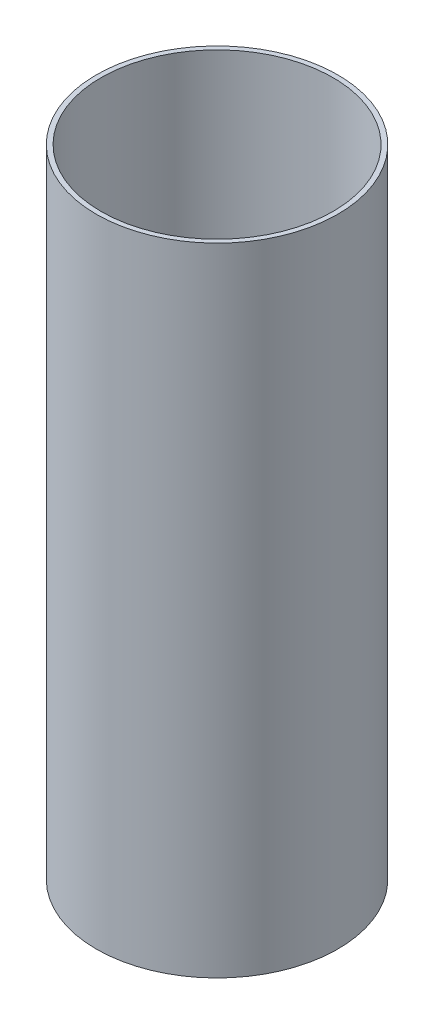
ISO-10303-21;
HEADER;
FILE_DESCRIPTION(('STEP AP214'),'2;1');
FILE_NAME('part.step','',(''),(''),'','','');
FILE_SCHEMA(('AUTOMOTIVE_DESIGN { 1 0 10303 214 1 1 1 1 }'));
ENDSEC;
DATA;
#1=APPLICATION_CONTEXT('core data for automotive mechanical design processes');
#2=APPLICATION_PROTOCOL_DEFINITION('international standard','automotive_design',2000,#1);
#3=PRODUCT_CONTEXT('',#1,'mechanical');
#4=PRODUCT('Part','Part','',(#3));
#5=PRODUCT_RELATED_PRODUCT_CATEGORY('part','',(#4));
#6=PRODUCT_DEFINITION_FORMATION('','',#4);
#7=PRODUCT_DEFINITION_CONTEXT('part definition',#1,'design');
#8=PRODUCT_DEFINITION('design','',#6,#7);
#9=PRODUCT_DEFINITION_SHAPE('','',#8);
#10=(LENGTH_UNIT() NAMED_UNIT(*) SI_UNIT(.MILLI.,.METRE.));
#11=(NAMED_UNIT(*) PLANE_ANGLE_UNIT() SI_UNIT($,.RADIAN.));
#12=(NAMED_UNIT(*) SI_UNIT($,.STERADIAN.) SOLID_ANGLE_UNIT());
#13=UNCERTAINTY_MEASURE_WITH_UNIT(LENGTH_MEASURE(1.E-05),#10,'distance_accuracy_value','');
#14=(GEOMETRIC_REPRESENTATION_CONTEXT(3) GLOBAL_UNCERTAINTY_ASSIGNED_CONTEXT((#13)) GLOBAL_UNIT_ASSIGNED_CONTEXT((#10,
#11,#12)) REPRESENTATION_CONTEXT('',''));
#15=CARTESIAN_POINT('',(0.,0.,0.));
#16=DIRECTION('',(0.,0.,1.));
#17=DIRECTION('',(1.,0.,0.));
#18=AXIS2_PLACEMENT_3D('',#15,#16,#17);
#19=CARTESIAN_POINT('',(0.,200.,0.));
#20=DIRECTION('',(0.,1.,0.));
#21=DIRECTION('',(0.,0.,1.));
#22=AXIS2_PLACEMENT_3D('',#19,#20,#21);
#23=PLANE('',#22);
#24=CARTESIAN_POINT('',(0.,200.,0.));
#25=DIRECTION('',(0.,1.,0.));
#26=DIRECTION('',(0.,0.,1.));
#27=AXIS2_PLACEMENT_3D('',#24,#25,#26);
#28=CIRCLE('',#27,37.95);
#29=CARTESIAN_POINT('',(0.,200.,37.95));
#30=VERTEX_POINT('',#29);
#31=EDGE_CURVE('E10',#30,#30,#28,.T.);
#32=ORIENTED_EDGE('',*,*,#31,.T.);
#33=EDGE_LOOP('',(#32));
#34=FACE_BOUND('',#33,.T.);
#35=CARTESIAN_POINT('',(0.,200.,0.));
#36=DIRECTION('',(0.,1.,0.));
#37=DIRECTION('',(0.,0.,1.));
#38=AXIS2_PLACEMENT_3D('',#35,#36,#37);
#39=CIRCLE('',#38,36.45);
#40=CARTESIAN_POINT('',(0.,200.,36.45));
#41=VERTEX_POINT('',#40);
#42=EDGE_CURVE('E44',#41,#41,#39,.T.);
#43=ORIENTED_EDGE('',*,*,#42,.F.);
#44=EDGE_LOOP('',(#43));
#45=FACE_BOUND('',#44,.T.);
#46=ADVANCED_FACE('F33',(#34,#45),#23,.T.);
#47=CARTESIAN_POINT('',(0.,0.,0.));
#48=DIRECTION('',(0.,1.,0.));
#49=DIRECTION('',(0.,0.,1.));
#50=AXIS2_PLACEMENT_3D('',#47,#48,#49);
#51=PLANE('',#50);
#52=CARTESIAN_POINT('',(0.,0.,0.));
#53=DIRECTION('',(0.,1.,0.));
#54=DIRECTION('',(0.,0.,1.));
#55=AXIS2_PLACEMENT_3D('',#52,#53,#54);
#56=CIRCLE('',#55,37.95);
#57=CARTESIAN_POINT('',(0.,0.,37.95));
#58=VERTEX_POINT('',#57);
#59=EDGE_CURVE('E37',#58,#58,#56,.T.);
#60=ORIENTED_EDGE('',*,*,#59,.F.);
#61=EDGE_LOOP('',(#60));
#62=FACE_BOUND('',#61,.T.);
#63=CARTESIAN_POINT('',(0.,0.,0.));
#64=DIRECTION('',(0.,1.,0.));
#65=DIRECTION('',(0.,0.,1.));
#66=AXIS2_PLACEMENT_3D('',#63,#64,#65);
#67=CIRCLE('',#66,36.45);
#68=CARTESIAN_POINT('',(0.,0.,36.45));
#69=VERTEX_POINT('',#68);
#70=EDGE_CURVE('E46',#69,#69,#67,.T.);
#71=ORIENTED_EDGE('',*,*,#70,.T.);
#72=EDGE_LOOP('',(#71));
#73=FACE_BOUND('',#72,.T.);
#74=ADVANCED_FACE('F56',(#62,#73),#51,.F.);
#75=CARTESIAN_POINT('',(0.,200.,0.));
#76=DIRECTION('',(0.,-1.,0.));
#77=DIRECTION('',(0.,0.,-1.));
#78=AXIS2_PLACEMENT_3D('',#75,#76,#77);
#79=CYLINDRICAL_SURFACE('',#78,37.95);
#80=ORIENTED_EDGE('',*,*,#31,.F.);
#81=EDGE_LOOP('',(#80));
#82=FACE_BOUND('',#81,.T.);
#83=ORIENTED_EDGE('',*,*,#59,.T.);
#84=EDGE_LOOP('',(#83));
#85=FACE_BOUND('',#84,.T.);
#86=ADVANCED_FACE('F35',(#82,#85),#79,.T.);
#87=CARTESIAN_POINT('',(0.,200.,0.));
#88=DIRECTION('',(0.,-1.,0.));
#89=DIRECTION('',(0.,0.,-1.));
#90=AXIS2_PLACEMENT_3D('',#87,#88,#89);
#91=CYLINDRICAL_SURFACE('',#90,36.45);
#92=ORIENTED_EDGE('',*,*,#42,.T.);
#93=EDGE_LOOP('',(#92));
#94=FACE_BOUND('',#93,.T.);
#95=ORIENTED_EDGE('',*,*,#70,.F.);
#96=EDGE_LOOP('',(#95));
#97=FACE_BOUND('',#96,.T.);
#98=ADVANCED_FACE('F52',(#94,#97),#91,.F.);
#99=CLOSED_SHELL('',(#46,#74,#86,#98));
#100=MANIFOLD_SOLID_BREP('B2',#99);
#101=ADVANCED_BREP_SHAPE_REPRESENTATION('',(#18,#100),#14);
#102=SHAPE_DEFINITION_REPRESENTATION(#9,#101);
ENDSEC;
END-ISO-10303-21;
